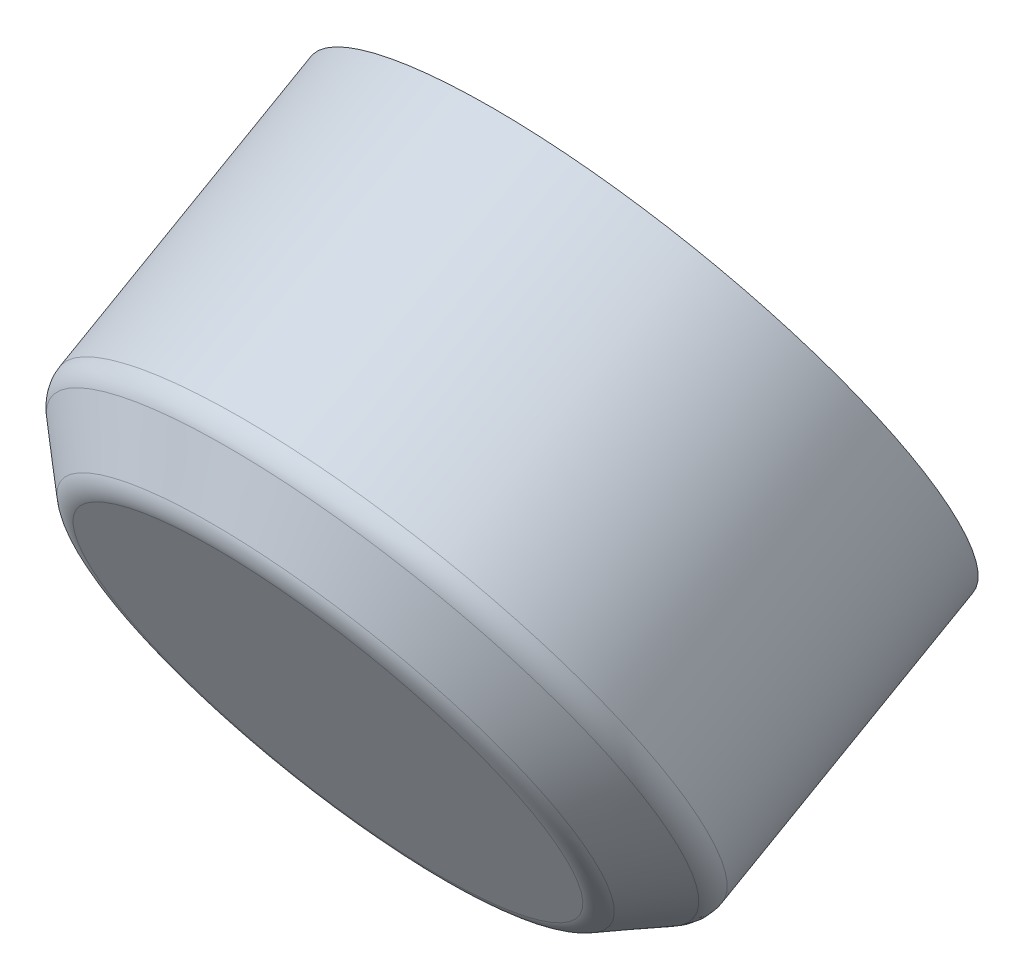
ISO-10303-21;
HEADER;
FILE_DESCRIPTION(('STEP AP214'),'2;1');
FILE_NAME('part.step','',(''),(''),'','','');
FILE_SCHEMA(('AUTOMOTIVE_DESIGN { 1 0 10303 214 1 1 1 1 }'));
ENDSEC;
DATA;
#1=APPLICATION_CONTEXT('core data for automotive mechanical design processes');
#2=APPLICATION_PROTOCOL_DEFINITION('international standard','automotive_design',2000,#1);
#3=PRODUCT_CONTEXT('',#1,'mechanical');
#4=PRODUCT('Part','Part','',(#3));
#5=PRODUCT_RELATED_PRODUCT_CATEGORY('part','',(#4));
#6=PRODUCT_DEFINITION_FORMATION('','',#4);
#7=PRODUCT_DEFINITION_CONTEXT('part definition',#1,'design');
#8=PRODUCT_DEFINITION('design','',#6,#7);
#9=PRODUCT_DEFINITION_SHAPE('','',#8);
#10=(LENGTH_UNIT() NAMED_UNIT(*) SI_UNIT(.MILLI.,.METRE.));
#11=(NAMED_UNIT(*) PLANE_ANGLE_UNIT() SI_UNIT($,.RADIAN.));
#12=(NAMED_UNIT(*) SI_UNIT($,.STERADIAN.) SOLID_ANGLE_UNIT());
#13=UNCERTAINTY_MEASURE_WITH_UNIT(LENGTH_MEASURE(1.E-05),#10,'distance_accuracy_value','');
#14=(GEOMETRIC_REPRESENTATION_CONTEXT(3) GLOBAL_UNCERTAINTY_ASSIGNED_CONTEXT((#13)) GLOBAL_UNIT_ASSIGNED_CONTEXT((#10,
#11,#12)) REPRESENTATION_CONTEXT('',''));
#15=CARTESIAN_POINT('',(0.,0.,0.));
#16=DIRECTION('',(0.,0.,1.));
#17=DIRECTION('',(1.,0.,0.));
#18=AXIS2_PLACEMENT_3D('',#15,#16,#17);
#19=CARTESIAN_POINT('',(-6.06217782649108,28.3772899317608,62.6782662809474));
#20=DIRECTION('',(-0.500000000000002,0.752613112060215,0.42845478589349));
#21=DIRECTION('',(-0.832939072330603,-0.553364709558745,0.));
#22=AXIS2_PLACEMENT_3D('',#19,#20,#21);
#23=PLANE('',#22);
#24=DIRECTION('',(0.866025403784437,0.43452138284361,0.247368485971191));
#25=VECTOR('',#24,1.);
#26=CARTESIAN_POINT('',(-6.06217782649108,31.8404487353575,56.5949669211369));
#27=LINE('',#26,#25);
#28=CARTESIAN_POINT('',(-6.06217782649108,31.8404487353575,56.5949669211369));
#29=VERTEX_POINT('',#28);
#30=CARTESIAN_POINT('',(0.,34.8820984152627,58.3265463229352));
#31=VERTEX_POINT('',#30);
#32=EDGE_CURVE('E129',#29,#31,#27,.T.);
#33=ORIENTED_EDGE('',*,*,#32,.T.);
#34=DIRECTION('',(0.,0.494736971942381,-0.869042765687215));
#35=VECTOR('',#34,1.);
#36=CARTESIAN_POINT('',(0.,31.4189396116661,64.4098456827457));
#37=LINE('',#36,#35);
#38=CARTESIAN_POINT('',(0.,31.4189396116661,64.4098456827457));
#39=VERTEX_POINT('',#38);
#40=EDGE_CURVE('E88',#39,#31,#37,.T.);
#41=ORIENTED_EDGE('',*,*,#40,.F.);
#42=DIRECTION('',(0.866025403784437,0.43452138284361,0.247368485971191));
#43=VECTOR('',#42,1.);
#44=CARTESIAN_POINT('',(-6.06217782649108,28.3772899317608,62.6782662809474));
#45=LINE('',#44,#43);
#46=CARTESIAN_POINT('',(-6.06217782649108,28.3772899317608,62.6782662809474));
#47=VERTEX_POINT('',#46);
#48=EDGE_CURVE('E143',#47,#39,#45,.T.);
#49=ORIENTED_EDGE('',*,*,#48,.F.);
#50=DIRECTION('',(0.,0.494736971942381,-0.869042765687215));
#51=VECTOR('',#50,1.);
#52=CARTESIAN_POINT('',(-6.06217782649108,28.3772899317608,62.6782662809474));
#53=LINE('',#52,#51);
#54=EDGE_CURVE('E59',#47,#29,#53,.T.);
#55=ORIENTED_EDGE('',*,*,#54,.T.);
#56=EDGE_LOOP('',(#33,#41,#49,#55));
#57=FACE_BOUND('',#56,.T.);
#58=ADVANCED_FACE('F42',(#57),#23,.F.);
#59=CARTESIAN_POINT('',(-6.06217782649107,22.2939905719503,59.2151074773507));
#60=DIRECTION('',(-1.,0.,0.));
#61=DIRECTION('',(0.,-1.,0.));
#62=AXIS2_PLACEMENT_3D('',#59,#60,#61);
#63=PLANE('',#62);
#64=DIRECTION('',(0.,0.869042765687215,0.494736971942381));
#65=VECTOR('',#64,1.);
#66=CARTESIAN_POINT('',(-6.06217782649107,25.757149375547,53.1318081175402));
#67=LINE('',#66,#65);
#68=CARTESIAN_POINT('',(-6.06217782649107,25.757149375547,53.1318081175402));
#69=VERTEX_POINT('',#68);
#70=EDGE_CURVE('E141',#69,#29,#67,.T.);
#71=ORIENTED_EDGE('',*,*,#70,.T.);
#72=ORIENTED_EDGE('',*,*,#54,.F.);
#73=DIRECTION('',(0.,0.869042765687215,0.494736971942381));
#74=VECTOR('',#73,1.);
#75=CARTESIAN_POINT('',(-6.06217782649107,22.2939905719503,59.2151074773507));
#76=LINE('',#75,#74);
#77=CARTESIAN_POINT('',(-6.06217782649107,22.2939905719503,59.2151074773507));
#78=VERTEX_POINT('',#77);
#79=EDGE_CURVE('E116',#78,#47,#76,.T.);
#80=ORIENTED_EDGE('',*,*,#79,.F.);
#81=DIRECTION('',(0.,0.494736971942381,-0.869042765687215));
#82=VECTOR('',#81,1.);
#83=CARTESIAN_POINT('',(-6.06217782649107,22.2939905719503,59.2151074773507));
#84=LINE('',#83,#82);
#85=EDGE_CURVE('E79',#78,#69,#84,.T.);
#86=ORIENTED_EDGE('',*,*,#85,.T.);
#87=EDGE_LOOP('',(#71,#72,#80,#86));
#88=FACE_BOUND('',#87,.T.);
#89=ADVANCED_FACE('F192',(#88),#63,.F.);
#90=CARTESIAN_POINT('',(0.,19.2523408920451,57.4835280755524));
#91=DIRECTION('',(-0.499999999999998,-0.752613112060217,-0.428454785893491));
#92=DIRECTION('',(0.832939072330606,-0.553364709558741,0.));
#93=AXIS2_PLACEMENT_3D('',#90,#91,#92);
#94=PLANE('',#93);
#95=DIRECTION('',(-0.86602540378444,0.434521382843607,0.247368485971189));
#96=VECTOR('',#95,1.);
#97=CARTESIAN_POINT('',(0.,22.7154996956417,51.4002287157419));
#98=LINE('',#97,#96);
#99=CARTESIAN_POINT('',(0.,22.7154996956417,51.4002287157419));
#100=VERTEX_POINT('',#99);
#101=EDGE_CURVE('E139',#100,#69,#98,.T.);
#102=ORIENTED_EDGE('',*,*,#101,.T.);
#103=ORIENTED_EDGE('',*,*,#85,.F.);
#104=DIRECTION('',(-0.86602540378444,0.434521382843607,0.247368485971189));
#105=VECTOR('',#104,1.);
#106=CARTESIAN_POINT('',(0.,19.2523408920451,57.4835280755524));
#107=LINE('',#106,#105);
#108=CARTESIAN_POINT('',(0.,19.2523408920451,57.4835280755524));
#109=VERTEX_POINT('',#108);
#110=EDGE_CURVE('E112',#109,#78,#107,.T.);
#111=ORIENTED_EDGE('',*,*,#110,.F.);
#112=DIRECTION('',(0.,0.494736971942381,-0.869042765687215));
#113=VECTOR('',#112,1.);
#114=CARTESIAN_POINT('',(0.,19.2523408920451,57.4835280755524));
#115=LINE('',#114,#113);
#116=EDGE_CURVE('E99',#109,#100,#115,.T.);
#117=ORIENTED_EDGE('',*,*,#116,.T.);
#118=EDGE_LOOP('',(#102,#103,#111,#117));
#119=FACE_BOUND('',#118,.T.);
#120=ADVANCED_FACE('F113',(#119),#94,.F.);
#121=CARTESIAN_POINT('',(6.06217782649106,22.2939905719503,59.2151074773507));
#122=DIRECTION('',(0.5,-0.752613112060216,-0.428454785893491));
#123=DIRECTION('',(0.832939072330605,0.553364709558743,0.));
#124=AXIS2_PLACEMENT_3D('',#121,#122,#123);
#125=PLANE('',#124);
#126=DIRECTION('',(-0.866025403784438,-0.434521382843608,-0.24736848597119));
#127=VECTOR('',#126,1.);
#128=CARTESIAN_POINT('',(6.06217782649106,25.757149375547,53.1318081175402));
#129=LINE('',#128,#127);
#130=CARTESIAN_POINT('',(6.06217782649106,25.757149375547,53.1318081175402));
#131=VERTEX_POINT('',#130);
#132=EDGE_CURVE('E106',#131,#100,#129,.T.);
#133=ORIENTED_EDGE('',*,*,#132,.T.);
#134=ORIENTED_EDGE('',*,*,#116,.F.);
#135=DIRECTION('',(-0.866025403784438,-0.434521382843608,-0.24736848597119));
#136=VECTOR('',#135,1.);
#137=CARTESIAN_POINT('',(6.06217782649106,22.2939905719503,59.2151074773507));
#138=LINE('',#137,#136);
#139=CARTESIAN_POINT('',(6.06217782649106,22.2939905719503,59.2151074773507));
#140=VERTEX_POINT('',#139);
#141=EDGE_CURVE('E103',#140,#109,#138,.T.);
#142=ORIENTED_EDGE('',*,*,#141,.F.);
#143=DIRECTION('',(0.,0.494736971942381,-0.869042765687215));
#144=VECTOR('',#143,1.);
#145=CARTESIAN_POINT('',(6.06217782649106,22.2939905719503,59.2151074773507));
#146=LINE('',#145,#144);
#147=EDGE_CURVE('E109',#140,#131,#146,.T.);
#148=ORIENTED_EDGE('',*,*,#147,.T.);
#149=EDGE_LOOP('',(#133,#134,#142,#148));
#150=FACE_BOUND('',#149,.T.);
#151=ADVANCED_FACE('F101',(#150),#125,.F.);
#152=CARTESIAN_POINT('',(6.06217782649105,28.3772899317608,62.6782662809474));
#153=DIRECTION('',(1.,0.,0.));
#154=DIRECTION('',(0.,1.,0.));
#155=AXIS2_PLACEMENT_3D('',#152,#153,#154);
#156=PLANE('',#155);
#157=DIRECTION('',(0.,-0.869042765687215,-0.49473697194238));
#158=VECTOR('',#157,1.);
#159=CARTESIAN_POINT('',(6.06217782649105,31.8404487353575,56.5949669211369));
#160=LINE('',#159,#158);
#161=CARTESIAN_POINT('',(6.06217782649105,31.8404487353575,56.5949669211369));
#162=VERTEX_POINT('',#161);
#163=EDGE_CURVE('E135',#162,#131,#160,.T.);
#164=ORIENTED_EDGE('',*,*,#163,.T.);
#165=ORIENTED_EDGE('',*,*,#147,.F.);
#166=DIRECTION('',(0.,-0.869042765687215,-0.49473697194238));
#167=VECTOR('',#166,1.);
#168=CARTESIAN_POINT('',(6.06217782649105,28.3772899317608,62.6782662809474));
#169=LINE('',#168,#167);
#170=CARTESIAN_POINT('',(6.06217782649105,28.3772899317608,62.6782662809474));
#171=VERTEX_POINT('',#170);
#172=EDGE_CURVE('E122',#171,#140,#169,.T.);
#173=ORIENTED_EDGE('',*,*,#172,.F.);
#174=DIRECTION('',(0.,0.494736971942381,-0.869042765687215));
#175=VECTOR('',#174,1.);
#176=CARTESIAN_POINT('',(6.06217782649105,28.3772899317608,62.6782662809474));
#177=LINE('',#176,#175);
#178=EDGE_CURVE('E148',#171,#162,#177,.T.);
#179=ORIENTED_EDGE('',*,*,#178,.T.);
#180=EDGE_LOOP('',(#164,#165,#173,#179));
#181=FACE_BOUND('',#180,.T.);
#182=ADVANCED_FACE('F203',(#181),#156,.F.);
#183=CARTESIAN_POINT('',(0.,31.4189396116661,64.4098456827457));
#184=DIRECTION('',(0.5,0.752613112060216,0.428454785893491));
#185=DIRECTION('',(-0.832939072330605,0.553364709558743,0.));
#186=AXIS2_PLACEMENT_3D('',#183,#184,#185);
#187=PLANE('',#186);
#188=DIRECTION('',(0.866025403784438,-0.434521382843608,-0.24736848597119));
#189=VECTOR('',#188,1.);
#190=CARTESIAN_POINT('',(0.,34.8820984152627,58.3265463229352));
#191=LINE('',#190,#189);
#192=EDGE_CURVE('E131',#31,#162,#191,.T.);
#193=ORIENTED_EDGE('',*,*,#192,.T.);
#194=ORIENTED_EDGE('',*,*,#178,.F.);
#195=DIRECTION('',(0.866025403784438,-0.434521382843608,-0.24736848597119));
#196=VECTOR('',#195,1.);
#197=CARTESIAN_POINT('',(0.,31.4189396116661,64.4098456827457));
#198=LINE('',#197,#196);
#199=EDGE_CURVE('E124',#39,#171,#198,.T.);
#200=ORIENTED_EDGE('',*,*,#199,.F.);
#201=ORIENTED_EDGE('',*,*,#40,.T.);
#202=EDGE_LOOP('',(#193,#194,#200,#201));
#203=FACE_BOUND('',#202,.T.);
#204=ADVANCED_FACE('F200',(#203),#187,.F.);
#205=CARTESIAN_POINT('',(0.,-20.0026112606993,35.1360937160542));
#206=DIRECTION('',(0.,0.49473697194238,-0.869042765687216));
#207=DIRECTION('',(0.,0.869042765687216,0.49473697194238));
#208=AXIS2_PLACEMENT_3D('',#205,#206,#207);
#209=PLANE('',#208);
#210=ORIENTED_EDGE('',*,*,#48,.T.);
#211=ORIENTED_EDGE('',*,*,#199,.T.);
#212=ORIENTED_EDGE('',*,*,#172,.T.);
#213=ORIENTED_EDGE('',*,*,#141,.T.);
#214=ORIENTED_EDGE('',*,*,#110,.T.);
#215=ORIENTED_EDGE('',*,*,#79,.T.);
#216=EDGE_LOOP('',(#210,#211,#212,#213,#214,#215));
#217=FACE_BOUND('',#216,.T.);
#218=ADVANCED_FACE('F119',(#217),#209,.T.);
#219=CARTESIAN_POINT('',(0.,-16.5394524571027,29.0527943562437));
#220=DIRECTION('',(0.,0.49473697194238,-0.869042765687216));
#221=DIRECTION('',(0.,0.869042765687216,0.49473697194238));
#222=AXIS2_PLACEMENT_3D('',#219,#220,#221);
#223=PLANE('',#222);
#224=CARTESIAN_POINT('',(0.,28.7987990554522,54.8633875193385));
#225=DIRECTION('',(0.,0.49473697194238,-0.869042765687216));
#226=DIRECTION('',(0.,0.869042765687216,0.49473697194238));
#227=AXIS2_PLACEMENT_3D('',#224,#225,#226);
#228=CIRCLE('',#227,4.);
#229=CARTESIAN_POINT('',(0.,32.2749701182011,56.8423354071081));
#230=VERTEX_POINT('',#229);
#231=EDGE_CURVE('E132',#230,#230,#228,.T.);
#232=ORIENTED_EDGE('',*,*,#231,.T.);
#233=EDGE_LOOP('',(#232));
#234=FACE_BOUND('',#233,.T.);
#235=ORIENTED_EDGE('',*,*,#32,.F.);
#236=ORIENTED_EDGE('',*,*,#70,.F.);
#237=ORIENTED_EDGE('',*,*,#101,.F.);
#238=ORIENTED_EDGE('',*,*,#132,.F.);
#239=ORIENTED_EDGE('',*,*,#163,.F.);
#240=ORIENTED_EDGE('',*,*,#192,.F.);
#241=EDGE_LOOP('',(#235,#236,#237,#238,#239,#240));
#242=FACE_BOUND('',#241,.T.);
#243=ADVANCED_FACE('F212',(#234,#242),#223,.F.);
#244=CARTESIAN_POINT('',(0.,26.5724826817115,58.774079964931));
#245=DIRECTION('',(0.,0.494736971942381,-0.869042765687215));
#246=DIRECTION('',(0.,0.869042765687215,0.494736971942381));
#247=AXIS2_PLACEMENT_3D('',#244,#245,#246);
#248=CYLINDRICAL_SURFACE('',#247,4.);
#249=CARTESIAN_POINT('',(0.,30.0356414853082,52.6907806051205));
#250=DIRECTION('',(0.,0.494736971942381,-0.869042765687215));
#251=DIRECTION('',(0.,0.869042765687215,0.494736971942381));
#252=AXIS2_PLACEMENT_3D('',#249,#250,#251);
#253=CIRCLE('',#252,4.);
#254=CARTESIAN_POINT('',(0.,33.5118125480571,54.66972849289));
#255=VERTEX_POINT('',#254);
#256=EDGE_CURVE('E156',#255,#255,#253,.T.);
#257=ORIENTED_EDGE('',*,*,#256,.T.);
#258=EDGE_LOOP('',(#257));
#259=FACE_BOUND('',#258,.T.);
#260=ORIENTED_EDGE('',*,*,#231,.F.);
#261=EDGE_LOOP('',(#260));
#262=FACE_BOUND('',#261,.T.);
#263=ADVANCED_FACE('F176',(#259,#262),#248,.F.);
#264=CARTESIAN_POINT('',(0.,30.0356414853082,52.6907806051205));
#265=DIRECTION('',(0.,-0.494736971942381,0.869042765687215));
#266=DIRECTION('',(0.,-0.869042765687215,-0.494736971942381));
#267=AXIS2_PLACEMENT_3D('',#264,#265,#266);
#268=CYLINDRICAL_SURFACE('',#267,10.);
#269=CARTESIAN_POINT('',(0.,25.2931985294703,61.0212389621628));
#270=DIRECTION('',(0.,-0.494736971942381,0.869042765687215));
#271=DIRECTION('',(0.,-0.869042765687215,-0.494736971942381));
#272=AXIS2_PLACEMENT_3D('',#269,#270,#271);
#273=CIRCLE('',#272,10.);
#274=CARTESIAN_POINT('',(0.,16.6027708725982,56.073869242739));
#275=VERTEX_POINT('',#274);
#276=EDGE_CURVE('E153',#275,#275,#273,.F.);
#277=ORIENTED_EDGE('',*,*,#276,.T.);
#278=EDGE_LOOP('',(#277));
#279=FACE_BOUND('',#278,.T.);
#280=CARTESIAN_POINT('',(0.,30.0356414853082,52.6907806051205));
#281=DIRECTION('',(0.,-0.494736971942381,0.869042765687215));
#282=DIRECTION('',(0.,-0.869042765687215,-0.494736971942381));
#283=AXIS2_PLACEMENT_3D('',#280,#281,#282);
#284=CIRCLE('',#283,10.);
#285=CARTESIAN_POINT('',(0.,21.3452138284361,47.7434108856967));
#286=VERTEX_POINT('',#285);
#287=EDGE_CURVE('E145',#286,#286,#284,.T.);
#288=ORIENTED_EDGE('',*,*,#287,.T.);
#289=EDGE_LOOP('',(#288));
#290=FACE_BOUND('',#289,.T.);
#291=ADVANCED_FACE('F172',(#279,#290),#268,.T.);
#292=CARTESIAN_POINT('',(0.,30.0356414853082,52.6907806051205));
#293=DIRECTION('',(0.,-0.494736971942381,0.869042765687215));
#294=DIRECTION('',(0.,-0.869042765687215,-0.494736971942381));
#295=AXIS2_PLACEMENT_3D('',#292,#293,#294);
#296=PLANE('',#295);
#297=ORIENTED_EDGE('',*,*,#256,.F.);
#298=EDGE_LOOP('',(#297));
#299=FACE_BOUND('',#298,.T.);
#300=ORIENTED_EDGE('',*,*,#287,.F.);
#301=EDGE_LOOP('',(#300));
#302=FACE_BOUND('',#301,.T.);
#303=ADVANCED_FACE('F175',(#299,#302),#296,.F.);
#304=CARTESIAN_POINT('',(0.,24.0987978219996,63.1192937933671));
#305=DIRECTION('',(0.,-0.494736971942381,0.869042765687215));
#306=DIRECTION('',(0.,-0.869042765687215,-0.494736971942381));
#307=AXIS2_PLACEMENT_3D('',#304,#305,#306);
#308=PLANE('',#307);
#309=CARTESIAN_POINT('',(0.,24.0987978219996,63.1192937933671));
#310=DIRECTION('',(0.,-0.494736971942381,0.869042765687215));
#311=DIRECTION('',(0.,-0.869042765687215,-0.494736971942381));
#312=AXIS2_PLACEMENT_3D('',#309,#310,#311);
#313=CIRCLE('',#312,7.58578643762691);
#314=CARTESIAN_POINT('',(0.,17.5064249963318,59.366324781414));
#315=VERTEX_POINT('',#314);
#316=EDGE_CURVE('E11',#315,#315,#313,.T.);
#317=ORIENTED_EDGE('',*,*,#316,.T.);
#318=EDGE_LOOP('',(#317));
#319=FACE_BOUND('',#318,.T.);
#320=ADVANCED_FACE('F181',(#319),#308,.T.);
#321=CARTESIAN_POINT('',(0.,24.0987978219996,63.1192937933671));
#322=DIRECTION('',(0.,0.494736971942381,-0.869042765687215));
#323=DIRECTION('',(0.,0.869042765687215,0.494736971942381));
#324=AXIS2_PLACEMENT_3D('',#321,#322,#323);
#325=CONICAL_SURFACE('',#324,8.,0.785398163397443);
#326=CARTESIAN_POINT('',(0.,24.9433666617062,61.6357449949213));
#327=DIRECTION('',(0.,-0.494736971942381,0.869042765687215));
#328=DIRECTION('',(0.,-0.869042765687215,-0.494736971942381));
#329=AXIS2_PLACEMENT_3D('',#326,#327,#328);
#330=CIRCLE('',#329,9.70710678118656);
#331=CARTESIAN_POINT('',(0.,16.5074757377627,56.8332803796757));
#332=VERTEX_POINT('',#331);
#333=EDGE_CURVE('E51',#332,#332,#330,.T.);
#334=ORIENTED_EDGE('',*,*,#333,.T.);
#335=EDGE_LOOP('',(#334));
#336=FACE_BOUND('',#335,.T.);
#337=CARTESIAN_POINT('',(0.,24.2437029261779,62.8647570604384));
#338=DIRECTION('',(0.,-0.494736971942381,0.869042765687215));
#339=DIRECTION('',(0.,-0.869042765687215,-0.494736971942381));
#340=AXIS2_PLACEMENT_3D('',#337,#338,#339);
#341=CIRCLE('',#340,8.29289321881346);
#342=CARTESIAN_POINT('',(0.,17.0368240677515,58.7619561807211));
#343=VERTEX_POINT('',#342);
#344=EDGE_CURVE('E159',#343,#343,#341,.F.);
#345=ORIENTED_EDGE('',*,*,#344,.T.);
#346=EDGE_LOOP('',(#345));
#347=FACE_BOUND('',#346,.T.);
#348=ADVANCED_FACE('F164',(#336,#347),#325,.T.);
#349=CARTESIAN_POINT('',(0.,25.2931985294703,61.0212389621628));
#350=DIRECTION('',(0.,-0.494736971942381,0.869042765687215));
#351=DIRECTION('',(0.,-0.869042765687215,-0.494736971942381));
#352=AXIS2_PLACEMENT_3D('',#349,#350,#351);
#353=TOROIDAL_SURFACE('',#352,9.00000000000001,1.);
#354=ORIENTED_EDGE('',*,*,#333,.F.);
#355=EDGE_LOOP('',(#354));
#356=FACE_BOUND('',#355,.T.);
#357=ORIENTED_EDGE('',*,*,#276,.F.);
#358=EDGE_LOOP('',(#357));
#359=FACE_BOUND('',#358,.T.);
#360=ADVANCED_FACE('F167',(#356,#359),#353,.T.);
#361=CARTESIAN_POINT('',(0.,24.593534793942,62.2502510276799));
#362=DIRECTION('',(0.,-0.494736971942381,0.869042765687215));
#363=DIRECTION('',(0.,-0.869042765687215,-0.494736971942381));
#364=AXIS2_PLACEMENT_3D('',#361,#362,#363);
#365=TOROIDAL_SURFACE('',#364,7.58578643762691,1.);
#366=ORIENTED_EDGE('',*,*,#344,.F.);
#367=EDGE_LOOP('',(#366));
#368=FACE_BOUND('',#367,.T.);
#369=ORIENTED_EDGE('',*,*,#316,.F.);
#370=EDGE_LOOP('',(#369));
#371=FACE_BOUND('',#370,.T.);
#372=ADVANCED_FACE('F44',(#368,#371),#365,.T.);
#373=CLOSED_SHELL('',(#58,#89,#120,#151,#182,#204,#218,#243,#263,#291,#303,#320,#348,#360,#372));
#374=MANIFOLD_SOLID_BREP('B2',#373);
#375=ADVANCED_BREP_SHAPE_REPRESENTATION('',(#18,#374),#14);
#376=SHAPE_DEFINITION_REPRESENTATION(#9,#375);
ENDSEC;
END-ISO-10303-21;
